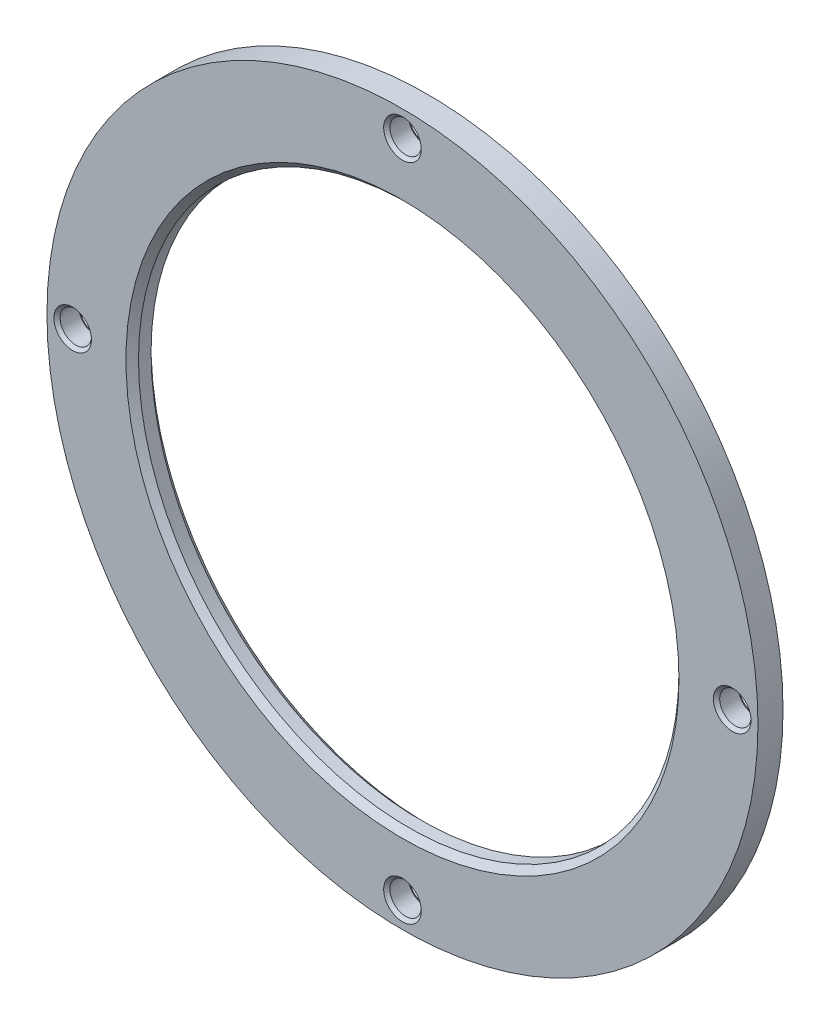
ISO-10303-21;
HEADER;
FILE_DESCRIPTION(('STEP AP214'),'2;1');
FILE_NAME('part.step','',(''),(''),'','','');
FILE_SCHEMA(('AUTOMOTIVE_DESIGN { 1 0 10303 214 1 1 1 1 }'));
ENDSEC;
DATA;
#1=APPLICATION_CONTEXT('core data for automotive mechanical design processes');
#2=APPLICATION_PROTOCOL_DEFINITION('international standard','automotive_design',2000,#1);
#3=PRODUCT_CONTEXT('',#1,'mechanical');
#4=PRODUCT('Part','Part','',(#3));
#5=PRODUCT_RELATED_PRODUCT_CATEGORY('part','',(#4));
#6=PRODUCT_DEFINITION_FORMATION('','',#4);
#7=PRODUCT_DEFINITION_CONTEXT('part definition',#1,'design');
#8=PRODUCT_DEFINITION('design','',#6,#7);
#9=PRODUCT_DEFINITION_SHAPE('','',#8);
#10=(LENGTH_UNIT() NAMED_UNIT(*) SI_UNIT(.MILLI.,.METRE.));
#11=(NAMED_UNIT(*) PLANE_ANGLE_UNIT() SI_UNIT($,.RADIAN.));
#12=(NAMED_UNIT(*) SI_UNIT($,.STERADIAN.) SOLID_ANGLE_UNIT());
#13=UNCERTAINTY_MEASURE_WITH_UNIT(LENGTH_MEASURE(1.E-05),#10,'distance_accuracy_value','');
#14=(GEOMETRIC_REPRESENTATION_CONTEXT(3) GLOBAL_UNCERTAINTY_ASSIGNED_CONTEXT((#13)) GLOBAL_UNIT_ASSIGNED_CONTEXT((#10,
#11,#12)) REPRESENTATION_CONTEXT('',''));
#15=CARTESIAN_POINT('',(0.,0.,0.));
#16=DIRECTION('',(0.,0.,1.));
#17=DIRECTION('',(1.,0.,0.));
#18=AXIS2_PLACEMENT_3D('',#15,#16,#17);
#19=CARTESIAN_POINT('',(0.,0.,2.));
#20=DIRECTION('',(0.,0.,1.));
#21=DIRECTION('',(1.,0.,0.));
#22=AXIS2_PLACEMENT_3D('',#19,#20,#21);
#23=PLANE('',#22);
#24=CARTESIAN_POINT('',(-2.75477877634723E-13,-26.3,2.));
#25=DIRECTION('',(0.,0.,1.));
#26=DIRECTION('',(1.,0.,0.));
#27=AXIS2_PLACEMENT_3D('',#24,#25,#26);
#28=CIRCLE('',#27,1.49999999999999);
#29=CARTESIAN_POINT('',(1.49999999999972,-26.3,2.));
#30=VERTEX_POINT('',#29);
#31=EDGE_CURVE('E11',#30,#30,#28,.F.);
#32=ORIENTED_EDGE('',*,*,#31,.T.);
#33=EDGE_LOOP('',(#32));
#34=FACE_BOUND('',#33,.T.);
#35=CARTESIAN_POINT('',(26.3,0.,2.));
#36=DIRECTION('',(0.,0.,1.));
#37=DIRECTION('',(1.,0.,0.));
#38=AXIS2_PLACEMENT_3D('',#35,#36,#37);
#39=CIRCLE('',#38,1.49999999999999);
#40=CARTESIAN_POINT('',(27.8,0.,2.));
#41=VERTEX_POINT('',#40);
#42=EDGE_CURVE('E58',#41,#41,#39,.F.);
#43=ORIENTED_EDGE('',*,*,#42,.T.);
#44=EDGE_LOOP('',(#43));
#45=FACE_BOUND('',#44,.T.);
#46=CARTESIAN_POINT('',(0.,26.3,2.));
#47=DIRECTION('',(0.,0.,1.));
#48=DIRECTION('',(1.,0.,0.));
#49=AXIS2_PLACEMENT_3D('',#46,#47,#48);
#50=CIRCLE('',#49,1.49999999999999);
#51=CARTESIAN_POINT('',(1.50000000000009,26.3,2.));
#52=VERTEX_POINT('',#51);
#53=EDGE_CURVE('E62',#52,#52,#50,.F.);
#54=ORIENTED_EDGE('',*,*,#53,.T.);
#55=EDGE_LOOP('',(#54));
#56=FACE_BOUND('',#55,.T.);
#57=CARTESIAN_POINT('',(-26.3,0.,2.));
#58=DIRECTION('',(0.,0.,1.));
#59=DIRECTION('',(1.,0.,0.));
#60=AXIS2_PLACEMENT_3D('',#57,#58,#59);
#61=CIRCLE('',#60,1.49999999999999);
#62=CARTESIAN_POINT('',(-24.8,0.,2.));
#63=VERTEX_POINT('',#62);
#64=EDGE_CURVE('E66',#63,#63,#61,.F.);
#65=ORIENTED_EDGE('',*,*,#64,.T.);
#66=EDGE_LOOP('',(#65));
#67=FACE_BOUND('',#66,.T.);
#68=CARTESIAN_POINT('',(0.,0.,2.));
#69=DIRECTION('',(0.,0.,1.));
#70=DIRECTION('',(1.,0.,0.));
#71=AXIS2_PLACEMENT_3D('',#68,#69,#70);
#72=CIRCLE('',#71,22.05);
#73=CARTESIAN_POINT('',(22.05,0.,2.));
#74=VERTEX_POINT('',#73);
#75=EDGE_CURVE('E110',#74,#74,#72,.F.);
#76=ORIENTED_EDGE('',*,*,#75,.T.);
#77=EDGE_LOOP('',(#76));
#78=FACE_BOUND('',#77,.T.);
#79=CARTESIAN_POINT('',(0.,0.,2.));
#80=DIRECTION('',(0.,0.,1.));
#81=DIRECTION('',(1.,0.,0.));
#82=AXIS2_PLACEMENT_3D('',#79,#80,#81);
#83=CIRCLE('',#82,28.35);
#84=CARTESIAN_POINT('',(28.35,0.,2.));
#85=VERTEX_POINT('',#84);
#86=EDGE_CURVE('E119',#85,#85,#83,.T.);
#87=ORIENTED_EDGE('',*,*,#86,.T.);
#88=EDGE_LOOP('',(#87));
#89=FACE_BOUND('',#88,.T.);
#90=ADVANCED_FACE('F50',(#34,#45,#56,#67,#78,#89),#23,.T.);
#91=CARTESIAN_POINT('',(0.,0.,0.));
#92=DIRECTION('',(0.,0.,1.));
#93=DIRECTION('',(1.,0.,0.));
#94=AXIS2_PLACEMENT_3D('',#91,#92,#93);
#95=PLANE('',#94);
#96=CARTESIAN_POINT('',(-26.3,0.,0.));
#97=DIRECTION('',(0.,0.,1.));
#98=DIRECTION('',(1.,0.,0.));
#99=AXIS2_PLACEMENT_3D('',#96,#97,#98);
#100=CIRCLE('',#99,1.49999999999999);
#101=CARTESIAN_POINT('',(-24.8,0.,0.));
#102=VERTEX_POINT('',#101);
#103=EDGE_CURVE('E95',#102,#102,#100,.T.);
#104=ORIENTED_EDGE('',*,*,#103,.T.);
#105=EDGE_LOOP('',(#104));
#106=FACE_BOUND('',#105,.T.);
#107=CARTESIAN_POINT('',(0.,26.3,0.));
#108=DIRECTION('',(0.,0.,1.));
#109=DIRECTION('',(1.,0.,0.));
#110=AXIS2_PLACEMENT_3D('',#107,#108,#109);
#111=CIRCLE('',#110,1.49999999999999);
#112=CARTESIAN_POINT('',(1.50000000000009,26.3,0.));
#113=VERTEX_POINT('',#112);
#114=EDGE_CURVE('E98',#113,#113,#111,.T.);
#115=ORIENTED_EDGE('',*,*,#114,.T.);
#116=EDGE_LOOP('',(#115));
#117=FACE_BOUND('',#116,.T.);
#118=CARTESIAN_POINT('',(26.3,0.,0.));
#119=DIRECTION('',(0.,0.,1.));
#120=DIRECTION('',(1.,0.,0.));
#121=AXIS2_PLACEMENT_3D('',#118,#119,#120);
#122=CIRCLE('',#121,1.49999999999999);
#123=CARTESIAN_POINT('',(27.8,0.,0.));
#124=VERTEX_POINT('',#123);
#125=EDGE_CURVE('E101',#124,#124,#122,.T.);
#126=ORIENTED_EDGE('',*,*,#125,.T.);
#127=EDGE_LOOP('',(#126));
#128=FACE_BOUND('',#127,.T.);
#129=CARTESIAN_POINT('',(-2.75477877634723E-13,-26.3,0.));
#130=DIRECTION('',(0.,0.,1.));
#131=DIRECTION('',(1.,0.,0.));
#132=AXIS2_PLACEMENT_3D('',#129,#130,#131);
#133=CIRCLE('',#132,1.49999999999999);
#134=CARTESIAN_POINT('',(1.49999999999972,-26.3,0.));
#135=VERTEX_POINT('',#134);
#136=EDGE_CURVE('E104',#135,#135,#133,.T.);
#137=ORIENTED_EDGE('',*,*,#136,.T.);
#138=EDGE_LOOP('',(#137));
#139=FACE_BOUND('',#138,.T.);
#140=CARTESIAN_POINT('',(0.,0.,0.));
#141=DIRECTION('',(0.,0.,1.));
#142=DIRECTION('',(1.,0.,0.));
#143=AXIS2_PLACEMENT_3D('',#140,#141,#142);
#144=CIRCLE('',#143,22.05);
#145=CARTESIAN_POINT('',(22.05,0.,0.));
#146=VERTEX_POINT('',#145);
#147=EDGE_CURVE('E107',#146,#146,#144,.T.);
#148=ORIENTED_EDGE('',*,*,#147,.T.);
#149=EDGE_LOOP('',(#148));
#150=FACE_BOUND('',#149,.T.);
#151=CARTESIAN_POINT('',(0.,0.,0.));
#152=DIRECTION('',(0.,0.,1.));
#153=DIRECTION('',(1.,0.,0.));
#154=AXIS2_PLACEMENT_3D('',#151,#152,#153);
#155=CIRCLE('',#154,28.35);
#156=CARTESIAN_POINT('',(28.35,0.,0.));
#157=VERTEX_POINT('',#156);
#158=EDGE_CURVE('E120',#157,#157,#155,.T.);
#159=ORIENTED_EDGE('',*,*,#158,.F.);
#160=EDGE_LOOP('',(#159));
#161=FACE_BOUND('',#160,.T.);
#162=ADVANCED_FACE('F131',(#106,#117,#128,#139,#150,#161),#95,.F.);
#163=CARTESIAN_POINT('',(0.,0.,2.));
#164=DIRECTION('',(0.,0.,-1.));
#165=DIRECTION('',(-1.,0.,0.));
#166=AXIS2_PLACEMENT_3D('',#163,#164,#165);
#167=CYLINDRICAL_SURFACE('',#166,28.35);
#168=ORIENTED_EDGE('',*,*,#86,.F.);
#169=EDGE_LOOP('',(#168));
#170=FACE_BOUND('',#169,.T.);
#171=ORIENTED_EDGE('',*,*,#158,.T.);
#172=EDGE_LOOP('',(#171));
#173=FACE_BOUND('',#172,.T.);
#174=ADVANCED_FACE('F127',(#170,#173),#167,.T.);
#175=CARTESIAN_POINT('',(0.,0.,2.));
#176=DIRECTION('',(0.,0.,-1.));
#177=DIRECTION('',(-1.,0.,0.));
#178=AXIS2_PLACEMENT_3D('',#175,#176,#177);
#179=CYLINDRICAL_SURFACE('',#178,21.55);
#180=CARTESIAN_POINT('',(0.,0.,1.5));
#181=DIRECTION('',(0.,0.,1.));
#182=DIRECTION('',(1.,0.,0.));
#183=AXIS2_PLACEMENT_3D('',#180,#181,#182);
#184=CIRCLE('',#183,21.55);
#185=CARTESIAN_POINT('',(21.55,0.,1.5));
#186=VERTEX_POINT('',#185);
#187=EDGE_CURVE('E113',#186,#186,#184,.T.);
#188=ORIENTED_EDGE('',*,*,#187,.T.);
#189=EDGE_LOOP('',(#188));
#190=FACE_BOUND('',#189,.T.);
#191=CARTESIAN_POINT('',(0.,0.,0.500000000000014));
#192=DIRECTION('',(0.,0.,1.));
#193=DIRECTION('',(1.,0.,0.));
#194=AXIS2_PLACEMENT_3D('',#191,#192,#193);
#195=CIRCLE('',#194,21.55);
#196=CARTESIAN_POINT('',(21.55,0.,0.500000000000014));
#197=VERTEX_POINT('',#196);
#198=EDGE_CURVE('E116',#197,#197,#195,.F.);
#199=ORIENTED_EDGE('',*,*,#198,.T.);
#200=EDGE_LOOP('',(#199));
#201=FACE_BOUND('',#200,.T.);
#202=ADVANCED_FACE('F130',(#190,#201),#179,.F.);
#203=CARTESIAN_POINT('',(0.,0.,1.5));
#204=DIRECTION('',(0.,0.,1.));
#205=DIRECTION('',(1.,0.,0.));
#206=AXIS2_PLACEMENT_3D('',#203,#204,#205);
#207=CONICAL_SURFACE('',#206,21.55,0.785398163397459);
#208=ORIENTED_EDGE('',*,*,#75,.F.);
#209=EDGE_LOOP('',(#208));
#210=FACE_BOUND('',#209,.T.);
#211=ORIENTED_EDGE('',*,*,#187,.F.);
#212=EDGE_LOOP('',(#211));
#213=FACE_BOUND('',#212,.T.);
#214=ADVANCED_FACE('F147',(#210,#213),#207,.F.);
#215=CARTESIAN_POINT('',(0.,0.,0.));
#216=DIRECTION('',(0.,0.,-1.));
#217=DIRECTION('',(-1.,0.,0.));
#218=AXIS2_PLACEMENT_3D('',#215,#216,#217);
#219=CONICAL_SURFACE('',#218,22.05,0.785398163397435);
#220=ORIENTED_EDGE('',*,*,#198,.F.);
#221=EDGE_LOOP('',(#220));
#222=FACE_BOUND('',#221,.T.);
#223=ORIENTED_EDGE('',*,*,#147,.F.);
#224=EDGE_LOOP('',(#223));
#225=FACE_BOUND('',#224,.T.);
#226=ADVANCED_FACE('F153',(#222,#225),#219,.F.);
#227=CARTESIAN_POINT('',(-26.3,0.,2.));
#228=DIRECTION('',(0.,0.,-1.));
#229=DIRECTION('',(-1.,0.,0.));
#230=AXIS2_PLACEMENT_3D('',#227,#228,#229);
#231=CYLINDRICAL_SURFACE('',#230,1.25);
#232=CARTESIAN_POINT('',(-26.3,0.,0.249999999999997));
#233=DIRECTION('',(0.,0.,1.));
#234=DIRECTION('',(1.,0.,0.));
#235=AXIS2_PLACEMENT_3D('',#232,#233,#234);
#236=CIRCLE('',#235,1.25);
#237=CARTESIAN_POINT('',(-25.05,0.,0.249999999999997));
#238=VERTEX_POINT('',#237);
#239=EDGE_CURVE('E89',#238,#238,#236,.F.);
#240=ORIENTED_EDGE('',*,*,#239,.T.);
#241=EDGE_LOOP('',(#240));
#242=FACE_BOUND('',#241,.T.);
#243=CARTESIAN_POINT('',(-26.3,0.,1.75));
#244=DIRECTION('',(0.,0.,1.));
#245=DIRECTION('',(1.,0.,0.));
#246=AXIS2_PLACEMENT_3D('',#243,#244,#245);
#247=CIRCLE('',#246,1.25);
#248=CARTESIAN_POINT('',(-25.05,0.,1.75));
#249=VERTEX_POINT('',#248);
#250=EDGE_CURVE('E92',#249,#249,#247,.T.);
#251=ORIENTED_EDGE('',*,*,#250,.T.);
#252=EDGE_LOOP('',(#251));
#253=FACE_BOUND('',#252,.T.);
#254=ADVANCED_FACE('F160',(#242,#253),#231,.F.);
#255=CARTESIAN_POINT('',(-2.75477877634723E-13,-26.3,2.));
#256=DIRECTION('',(0.,0.,-1.));
#257=DIRECTION('',(-1.,0.,0.));
#258=AXIS2_PLACEMENT_3D('',#255,#256,#257);
#259=CYLINDRICAL_SURFACE('',#258,1.25);
#260=CARTESIAN_POINT('',(-2.75477877634723E-13,-26.3,0.249999999999997));
#261=DIRECTION('',(0.,0.,1.));
#262=DIRECTION('',(1.,0.,0.));
#263=AXIS2_PLACEMENT_3D('',#260,#261,#262);
#264=CIRCLE('',#263,1.25);
#265=CARTESIAN_POINT('',(1.24999999999973,-26.3,0.249999999999997));
#266=VERTEX_POINT('',#265);
#267=EDGE_CURVE('E71',#266,#266,#264,.F.);
#268=ORIENTED_EDGE('',*,*,#267,.T.);
#269=EDGE_LOOP('',(#268));
#270=FACE_BOUND('',#269,.T.);
#271=CARTESIAN_POINT('',(-2.75477877634723E-13,-26.3,1.75));
#272=DIRECTION('',(0.,0.,1.));
#273=DIRECTION('',(1.,0.,0.));
#274=AXIS2_PLACEMENT_3D('',#271,#272,#273);
#275=CIRCLE('',#274,1.25);
#276=CARTESIAN_POINT('',(1.24999999999973,-26.3,1.75));
#277=VERTEX_POINT('',#276);
#278=EDGE_CURVE('E74',#277,#277,#275,.T.);
#279=ORIENTED_EDGE('',*,*,#278,.T.);
#280=EDGE_LOOP('',(#279));
#281=FACE_BOUND('',#280,.T.);
#282=ADVANCED_FACE('F224',(#270,#281),#259,.F.);
#283=CARTESIAN_POINT('',(26.3,0.,2.));
#284=DIRECTION('',(0.,0.,-1.));
#285=DIRECTION('',(-1.,0.,0.));
#286=AXIS2_PLACEMENT_3D('',#283,#284,#285);
#287=CYLINDRICAL_SURFACE('',#286,1.25);
#288=CARTESIAN_POINT('',(26.3,0.,0.249999999999997));
#289=DIRECTION('',(0.,0.,1.));
#290=DIRECTION('',(1.,0.,0.));
#291=AXIS2_PLACEMENT_3D('',#288,#289,#290);
#292=CIRCLE('',#291,1.25);
#293=CARTESIAN_POINT('',(27.55,0.,0.249999999999997));
#294=VERTEX_POINT('',#293);
#295=EDGE_CURVE('E77',#294,#294,#292,.F.);
#296=ORIENTED_EDGE('',*,*,#295,.T.);
#297=EDGE_LOOP('',(#296));
#298=FACE_BOUND('',#297,.T.);
#299=CARTESIAN_POINT('',(26.3,0.,1.75));
#300=DIRECTION('',(0.,0.,1.));
#301=DIRECTION('',(1.,0.,0.));
#302=AXIS2_PLACEMENT_3D('',#299,#300,#301);
#303=CIRCLE('',#302,1.25);
#304=CARTESIAN_POINT('',(27.55,0.,1.75));
#305=VERTEX_POINT('',#304);
#306=EDGE_CURVE('E80',#305,#305,#303,.T.);
#307=ORIENTED_EDGE('',*,*,#306,.T.);
#308=EDGE_LOOP('',(#307));
#309=FACE_BOUND('',#308,.T.);
#310=ADVANCED_FACE('F218',(#298,#309),#287,.F.);
#311=CARTESIAN_POINT('',(0.,26.3,2.));
#312=DIRECTION('',(0.,0.,-1.));
#313=DIRECTION('',(-1.,0.,0.));
#314=AXIS2_PLACEMENT_3D('',#311,#312,#313);
#315=CYLINDRICAL_SURFACE('',#314,1.25);
#316=CARTESIAN_POINT('',(0.,26.3,0.249999999999997));
#317=DIRECTION('',(0.,0.,1.));
#318=DIRECTION('',(1.,0.,0.));
#319=AXIS2_PLACEMENT_3D('',#316,#317,#318);
#320=CIRCLE('',#319,1.25);
#321=CARTESIAN_POINT('',(1.25000000000009,26.3,0.249999999999997));
#322=VERTEX_POINT('',#321);
#323=EDGE_CURVE('E83',#322,#322,#320,.F.);
#324=ORIENTED_EDGE('',*,*,#323,.T.);
#325=EDGE_LOOP('',(#324));
#326=FACE_BOUND('',#325,.T.);
#327=CARTESIAN_POINT('',(0.,26.3,1.75));
#328=DIRECTION('',(0.,0.,1.));
#329=DIRECTION('',(1.,0.,0.));
#330=AXIS2_PLACEMENT_3D('',#327,#328,#329);
#331=CIRCLE('',#330,1.25);
#332=CARTESIAN_POINT('',(1.25000000000009,26.3,1.75));
#333=VERTEX_POINT('',#332);
#334=EDGE_CURVE('E86',#333,#333,#331,.T.);
#335=ORIENTED_EDGE('',*,*,#334,.T.);
#336=EDGE_LOOP('',(#335));
#337=FACE_BOUND('',#336,.T.);
#338=ADVANCED_FACE('F169',(#326,#337),#315,.F.);
#339=CARTESIAN_POINT('',(-26.3,0.,0.));
#340=DIRECTION('',(0.,0.,-1.));
#341=DIRECTION('',(-1.,0.,0.));
#342=AXIS2_PLACEMENT_3D('',#339,#340,#341);
#343=CONICAL_SURFACE('',#342,1.49999999999999,0.78539816339744);
#344=ORIENTED_EDGE('',*,*,#239,.F.);
#345=EDGE_LOOP('',(#344));
#346=FACE_BOUND('',#345,.T.);
#347=ORIENTED_EDGE('',*,*,#103,.F.);
#348=EDGE_LOOP('',(#347));
#349=FACE_BOUND('',#348,.T.);
#350=ADVANCED_FACE('F162',(#346,#349),#343,.F.);
#351=CARTESIAN_POINT('',(0.,26.3,0.));
#352=DIRECTION('',(0.,0.,-1.));
#353=DIRECTION('',(-1.,0.,0.));
#354=AXIS2_PLACEMENT_3D('',#351,#352,#353);
#355=CONICAL_SURFACE('',#354,1.49999999999999,0.78539816339744);
#356=ORIENTED_EDGE('',*,*,#323,.F.);
#357=EDGE_LOOP('',(#356));
#358=FACE_BOUND('',#357,.T.);
#359=ORIENTED_EDGE('',*,*,#114,.F.);
#360=EDGE_LOOP('',(#359));
#361=FACE_BOUND('',#360,.T.);
#362=ADVANCED_FACE('F168',(#358,#361),#355,.F.);
#363=CARTESIAN_POINT('',(26.3,0.,0.));
#364=DIRECTION('',(0.,0.,-1.));
#365=DIRECTION('',(-1.,0.,0.));
#366=AXIS2_PLACEMENT_3D('',#363,#364,#365);
#367=CONICAL_SURFACE('',#366,1.49999999999999,0.78539816339744);
#368=ORIENTED_EDGE('',*,*,#295,.F.);
#369=EDGE_LOOP('',(#368));
#370=FACE_BOUND('',#369,.T.);
#371=ORIENTED_EDGE('',*,*,#125,.F.);
#372=EDGE_LOOP('',(#371));
#373=FACE_BOUND('',#372,.T.);
#374=ADVANCED_FACE('F176',(#370,#373),#367,.F.);
#375=CARTESIAN_POINT('',(-2.75477877634723E-13,-26.3,0.));
#376=DIRECTION('',(0.,0.,-1.));
#377=DIRECTION('',(-1.,0.,0.));
#378=AXIS2_PLACEMENT_3D('',#375,#376,#377);
#379=CONICAL_SURFACE('',#378,1.49999999999999,0.78539816339744);
#380=ORIENTED_EDGE('',*,*,#267,.F.);
#381=EDGE_LOOP('',(#380));
#382=FACE_BOUND('',#381,.T.);
#383=ORIENTED_EDGE('',*,*,#136,.F.);
#384=EDGE_LOOP('',(#383));
#385=FACE_BOUND('',#384,.T.);
#386=ADVANCED_FACE('F183',(#382,#385),#379,.F.);
#387=CARTESIAN_POINT('',(-2.75477877634723E-13,-26.3,1.75));
#388=DIRECTION('',(0.,0.,1.));
#389=DIRECTION('',(1.,0.,0.));
#390=AXIS2_PLACEMENT_3D('',#387,#388,#389);
#391=CONICAL_SURFACE('',#390,1.25,0.78539816339744);
#392=ORIENTED_EDGE('',*,*,#31,.F.);
#393=EDGE_LOOP('',(#392));
#394=FACE_BOUND('',#393,.T.);
#395=ORIENTED_EDGE('',*,*,#278,.F.);
#396=EDGE_LOOP('',(#395));
#397=FACE_BOUND('',#396,.T.);
#398=ADVANCED_FACE('F190',(#394,#397),#391,.F.);
#399=CARTESIAN_POINT('',(26.3,0.,1.75));
#400=DIRECTION('',(0.,0.,1.));
#401=DIRECTION('',(1.,0.,0.));
#402=AXIS2_PLACEMENT_3D('',#399,#400,#401);
#403=CONICAL_SURFACE('',#402,1.25,0.78539816339744);
#404=ORIENTED_EDGE('',*,*,#42,.F.);
#405=EDGE_LOOP('',(#404));
#406=FACE_BOUND('',#405,.T.);
#407=ORIENTED_EDGE('',*,*,#306,.F.);
#408=EDGE_LOOP('',(#407));
#409=FACE_BOUND('',#408,.T.);
#410=ADVANCED_FACE('F197',(#406,#409),#403,.F.);
#411=CARTESIAN_POINT('',(0.,26.3,1.75));
#412=DIRECTION('',(0.,0.,1.));
#413=DIRECTION('',(1.,0.,0.));
#414=AXIS2_PLACEMENT_3D('',#411,#412,#413);
#415=CONICAL_SURFACE('',#414,1.25,0.78539816339744);
#416=ORIENTED_EDGE('',*,*,#53,.F.);
#417=EDGE_LOOP('',(#416));
#418=FACE_BOUND('',#417,.T.);
#419=ORIENTED_EDGE('',*,*,#334,.F.);
#420=EDGE_LOOP('',(#419));
#421=FACE_BOUND('',#420,.T.);
#422=ADVANCED_FACE('F203',(#418,#421),#415,.F.);
#423=CARTESIAN_POINT('',(-26.3,0.,1.75));
#424=DIRECTION('',(0.,0.,1.));
#425=DIRECTION('',(1.,0.,0.));
#426=AXIS2_PLACEMENT_3D('',#423,#424,#425);
#427=CONICAL_SURFACE('',#426,1.25,0.78539816339744);
#428=ORIENTED_EDGE('',*,*,#64,.F.);
#429=EDGE_LOOP('',(#428));
#430=FACE_BOUND('',#429,.T.);
#431=ORIENTED_EDGE('',*,*,#250,.F.);
#432=EDGE_LOOP('',(#431));
#433=FACE_BOUND('',#432,.T.);
#434=ADVANCED_FACE('F53',(#430,#433),#427,.F.);
#435=CLOSED_SHELL('',(#90,#162,#174,#202,#214,#226,#254,#282,#310,#338,#350,#362,#374,#386,#398,
#410,#422,#434));
#436=MANIFOLD_SOLID_BREP('B2',#435);
#437=ADVANCED_BREP_SHAPE_REPRESENTATION('',(#18,#436),#14);
#438=SHAPE_DEFINITION_REPRESENTATION(#9,#437);
ENDSEC;
END-ISO-10303-21;
